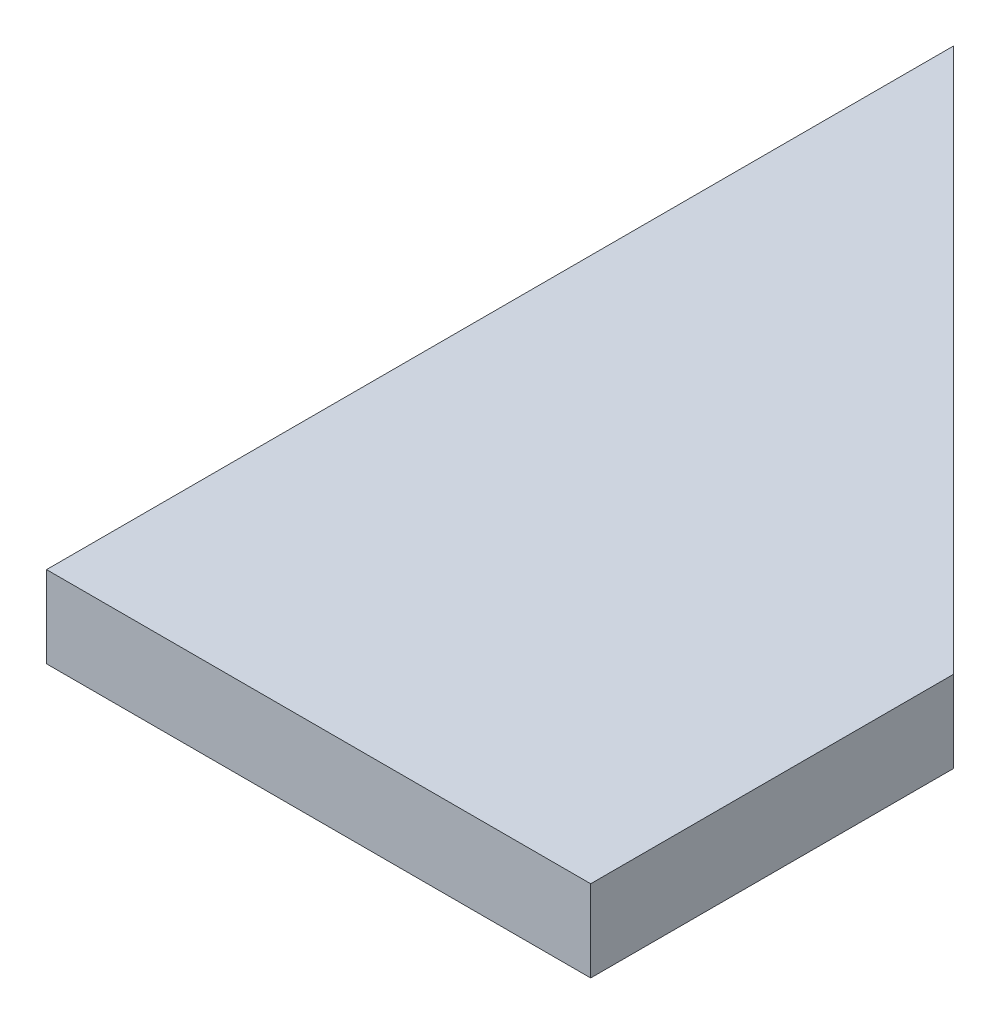
ISO-10303-21;
HEADER;
FILE_DESCRIPTION(('STEP AP214'),'2;1');
FILE_NAME('part.step','',(''),(''),'','','');
FILE_SCHEMA(('AUTOMOTIVE_DESIGN { 1 0 10303 214 1 1 1 1 }'));
ENDSEC;
DATA;
#1=APPLICATION_CONTEXT('core data for automotive mechanical design processes');
#2=APPLICATION_PROTOCOL_DEFINITION('international standard','automotive_design',2000,#1);
#3=PRODUCT_CONTEXT('',#1,'mechanical');
#4=PRODUCT('Part','Part','',(#3));
#5=PRODUCT_RELATED_PRODUCT_CATEGORY('part','',(#4));
#6=PRODUCT_DEFINITION_FORMATION('','',#4);
#7=PRODUCT_DEFINITION_CONTEXT('part definition',#1,'design');
#8=PRODUCT_DEFINITION('design','',#6,#7);
#9=PRODUCT_DEFINITION_SHAPE('','',#8);
#10=(LENGTH_UNIT() NAMED_UNIT(*) SI_UNIT(.MILLI.,.METRE.));
#11=(NAMED_UNIT(*) PLANE_ANGLE_UNIT() SI_UNIT($,.RADIAN.));
#12=(NAMED_UNIT(*) SI_UNIT($,.STERADIAN.) SOLID_ANGLE_UNIT());
#13=UNCERTAINTY_MEASURE_WITH_UNIT(LENGTH_MEASURE(1.E-05),#10,'distance_accuracy_value','');
#14=(GEOMETRIC_REPRESENTATION_CONTEXT(3) GLOBAL_UNCERTAINTY_ASSIGNED_CONTEXT((#13)) GLOBAL_UNIT_ASSIGNED_CONTEXT((#10,
#11,#12)) REPRESENTATION_CONTEXT('',''));
#15=CARTESIAN_POINT('',(0.,0.,0.));
#16=DIRECTION('',(0.,0.,1.));
#17=DIRECTION('',(1.,0.,0.));
#18=AXIS2_PLACEMENT_3D('',#15,#16,#17);
#19=CARTESIAN_POINT('',(0.,4.5,0.));
#20=DIRECTION('',(1.,0.,0.));
#21=DIRECTION('',(0.,0.,-1.));
#22=AXIS2_PLACEMENT_3D('',#19,#20,#21);
#23=PLANE('',#22);
#24=DIRECTION('',(0.,0.,1.));
#25=VECTOR('',#24,1.);
#26=CARTESIAN_POINT('',(0.,0.,0.));
#27=LINE('',#26,#25);
#28=CARTESIAN_POINT('',(-1.8682053493363E-13,0.,-50.));
#29=VERTEX_POINT('',#28);
#30=CARTESIAN_POINT('',(0.,0.,0.));
#31=VERTEX_POINT('',#30);
#32=EDGE_CURVE('E110',#29,#31,#27,.T.);
#33=ORIENTED_EDGE('',*,*,#32,.T.);
#34=DIRECTION('',(0.,-1.,0.));
#35=VECTOR('',#34,1.);
#36=CARTESIAN_POINT('',(0.,4.5,0.));
#37=LINE('',#36,#35);
#38=CARTESIAN_POINT('',(0.,4.5,0.));
#39=VERTEX_POINT('',#38);
#40=EDGE_CURVE('E11',#39,#31,#37,.T.);
#41=ORIENTED_EDGE('',*,*,#40,.F.);
#42=DIRECTION('',(0.,0.,1.));
#43=VECTOR('',#42,1.);
#44=CARTESIAN_POINT('',(0.,4.5,0.));
#45=LINE('',#44,#43);
#46=CARTESIAN_POINT('',(-1.8682053493363E-13,4.5,-50.));
#47=VERTEX_POINT('',#46);
#48=EDGE_CURVE('E94',#47,#39,#45,.T.);
#49=ORIENTED_EDGE('',*,*,#48,.F.);
#50=DIRECTION('',(0.,-1.,0.));
#51=VECTOR('',#50,1.);
#52=CARTESIAN_POINT('',(-1.8682053493363E-13,4.5,-50.));
#53=LINE('',#52,#51);
#54=EDGE_CURVE('E106',#47,#29,#53,.T.);
#55=ORIENTED_EDGE('',*,*,#54,.T.);
#56=EDGE_LOOP('',(#33,#41,#49,#55));
#57=FACE_BOUND('',#56,.T.);
#58=ADVANCED_FACE('F42',(#57),#23,.F.);
#59=CARTESIAN_POINT('',(0.,4.5,0.));
#60=DIRECTION('',(0.,0.,-1.));
#61=DIRECTION('',(-1.,0.,0.));
#62=AXIS2_PLACEMENT_3D('',#59,#60,#61);
#63=PLANE('',#62);
#64=DIRECTION('',(1.,0.,0.));
#65=VECTOR('',#64,1.);
#66=CARTESIAN_POINT('',(0.,0.,0.));
#67=LINE('',#66,#65);
#68=CARTESIAN_POINT('',(30.,0.,0.));
#69=VERTEX_POINT('',#68);
#70=EDGE_CURVE('E99',#31,#69,#67,.T.);
#71=ORIENTED_EDGE('',*,*,#70,.T.);
#72=DIRECTION('',(0.,-1.,0.));
#73=VECTOR('',#72,1.);
#74=CARTESIAN_POINT('',(30.,4.5,0.));
#75=LINE('',#74,#73);
#76=CARTESIAN_POINT('',(30.,4.5,0.));
#77=VERTEX_POINT('',#76);
#78=EDGE_CURVE('E51',#77,#69,#75,.T.);
#79=ORIENTED_EDGE('',*,*,#78,.F.);
#80=DIRECTION('',(1.,0.,0.));
#81=VECTOR('',#80,1.);
#82=CARTESIAN_POINT('',(0.,4.5,0.));
#83=LINE('',#82,#81);
#84=EDGE_CURVE('E89',#39,#77,#83,.T.);
#85=ORIENTED_EDGE('',*,*,#84,.F.);
#86=ORIENTED_EDGE('',*,*,#40,.T.);
#87=EDGE_LOOP('',(#71,#79,#85,#86));
#88=FACE_BOUND('',#87,.T.);
#89=ADVANCED_FACE('F98',(#88),#63,.F.);
#90=CARTESIAN_POINT('',(30.,4.5,0.));
#91=DIRECTION('',(-1.,0.,0.));
#92=DIRECTION('',(0.,0.,1.));
#93=AXIS2_PLACEMENT_3D('',#90,#91,#92);
#94=PLANE('',#93);
#95=DIRECTION('',(0.,0.,-1.));
#96=VECTOR('',#95,1.);
#97=CARTESIAN_POINT('',(30.,0.,0.));
#98=LINE('',#97,#96);
#99=CARTESIAN_POINT('',(29.9999999999999,0.,-19.9999999999998));
#100=VERTEX_POINT('',#99);
#101=EDGE_CURVE('E76',#69,#100,#98,.T.);
#102=ORIENTED_EDGE('',*,*,#101,.T.);
#103=DIRECTION('',(0.,-1.,0.));
#104=VECTOR('',#103,1.);
#105=CARTESIAN_POINT('',(29.9999999999999,4.5,-19.9999999999998));
#106=LINE('',#105,#104);
#107=CARTESIAN_POINT('',(29.9999999999999,4.5,-19.9999999999998));
#108=VERTEX_POINT('',#107);
#109=EDGE_CURVE('E101',#108,#100,#106,.T.);
#110=ORIENTED_EDGE('',*,*,#109,.F.);
#111=DIRECTION('',(0.,0.,-1.));
#112=VECTOR('',#111,1.);
#113=CARTESIAN_POINT('',(30.,4.5,0.));
#114=LINE('',#113,#112);
#115=EDGE_CURVE('E92',#77,#108,#114,.T.);
#116=ORIENTED_EDGE('',*,*,#115,.F.);
#117=ORIENTED_EDGE('',*,*,#78,.T.);
#118=EDGE_LOOP('',(#102,#110,#116,#117));
#119=FACE_BOUND('',#118,.T.);
#120=ADVANCED_FACE('F102',(#119),#94,.F.);
#121=CARTESIAN_POINT('',(-1.8682053493363E-13,4.5,-50.));
#122=DIRECTION('',(-0.707106781186548,0.,0.707106781186546));
#123=DIRECTION('',(0.707106781186546,0.,0.707106781186549));
#124=AXIS2_PLACEMENT_3D('',#121,#122,#123);
#125=PLANE('',#124);
#126=DIRECTION('',(-0.707106781186546,0.,-0.707106781186549));
#127=VECTOR('',#126,1.);
#128=CARTESIAN_POINT('',(-1.8682053493363E-13,0.,-50.));
#129=LINE('',#128,#127);
#130=EDGE_CURVE('E82',#100,#29,#129,.T.);
#131=ORIENTED_EDGE('',*,*,#130,.T.);
#132=ORIENTED_EDGE('',*,*,#54,.F.);
#133=DIRECTION('',(-0.707106781186546,0.,-0.707106781186549));
#134=VECTOR('',#133,1.);
#135=CARTESIAN_POINT('',(-1.8682053493363E-13,4.5,-50.));
#136=LINE('',#135,#134);
#137=EDGE_CURVE('E59',#108,#47,#136,.T.);
#138=ORIENTED_EDGE('',*,*,#137,.F.);
#139=ORIENTED_EDGE('',*,*,#109,.T.);
#140=EDGE_LOOP('',(#131,#132,#138,#139));
#141=FACE_BOUND('',#140,.T.);
#142=ADVANCED_FACE('F123',(#141),#125,.F.);
#143=CARTESIAN_POINT('',(0.,4.5,0.));
#144=DIRECTION('',(0.,-1.,0.));
#145=DIRECTION('',(0.,0.,-1.));
#146=AXIS2_PLACEMENT_3D('',#143,#144,#145);
#147=PLANE('',#146);
#148=ORIENTED_EDGE('',*,*,#48,.T.);
#149=ORIENTED_EDGE('',*,*,#84,.T.);
#150=ORIENTED_EDGE('',*,*,#115,.T.);
#151=ORIENTED_EDGE('',*,*,#137,.T.);
#152=EDGE_LOOP('',(#148,#149,#150,#151));
#153=FACE_BOUND('',#152,.T.);
#154=ADVANCED_FACE('F90',(#153),#147,.F.);
#155=CARTESIAN_POINT('',(0.,0.,0.));
#156=DIRECTION('',(0.,-1.,0.));
#157=DIRECTION('',(0.,0.,-1.));
#158=AXIS2_PLACEMENT_3D('',#155,#156,#157);
#159=PLANE('',#158);
#160=ORIENTED_EDGE('',*,*,#32,.F.);
#161=ORIENTED_EDGE('',*,*,#130,.F.);
#162=ORIENTED_EDGE('',*,*,#101,.F.);
#163=ORIENTED_EDGE('',*,*,#70,.F.);
#164=EDGE_LOOP('',(#160,#161,#162,#163));
#165=FACE_BOUND('',#164,.T.);
#166=ADVANCED_FACE('F126',(#165),#159,.T.);
#167=CLOSED_SHELL('',(#58,#89,#120,#142,#154,#166));
#168=MANIFOLD_SOLID_BREP('B2',#167);
#169=ADVANCED_BREP_SHAPE_REPRESENTATION('',(#18,#168),#14);
#170=SHAPE_DEFINITION_REPRESENTATION(#9,#169);
ENDSEC;
END-ISO-10303-21;
